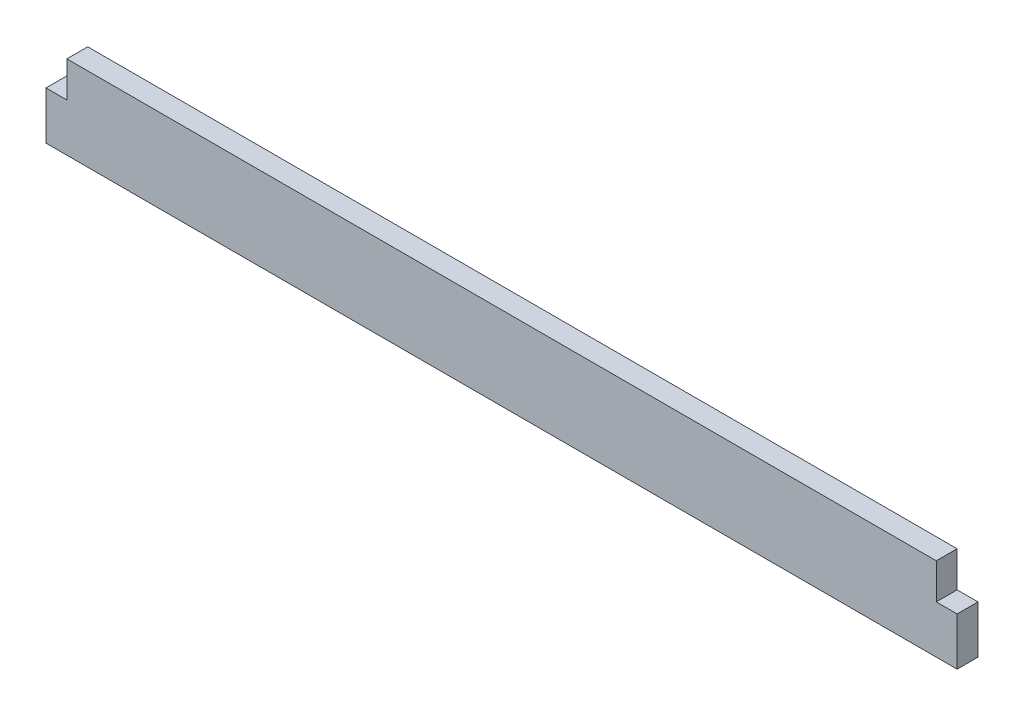
ISO-10303-21;
HEADER;
FILE_DESCRIPTION(('STEP AP214'),'2;1');
FILE_NAME('part.step','',(''),(''),'','','');
FILE_SCHEMA(('AUTOMOTIVE_DESIGN { 1 0 10303 214 1 1 1 1 }'));
ENDSEC;
DATA;
#1=APPLICATION_CONTEXT('core data for automotive mechanical design processes');
#2=APPLICATION_PROTOCOL_DEFINITION('international standard','automotive_design',2000,#1);
#3=PRODUCT_CONTEXT('',#1,'mechanical');
#4=PRODUCT('Part','Part','',(#3));
#5=PRODUCT_RELATED_PRODUCT_CATEGORY('part','',(#4));
#6=PRODUCT_DEFINITION_FORMATION('','',#4);
#7=PRODUCT_DEFINITION_CONTEXT('part definition',#1,'design');
#8=PRODUCT_DEFINITION('design','',#6,#7);
#9=PRODUCT_DEFINITION_SHAPE('','',#8);
#10=(LENGTH_UNIT() NAMED_UNIT(*) SI_UNIT(.MILLI.,.METRE.));
#11=(NAMED_UNIT(*) PLANE_ANGLE_UNIT() SI_UNIT($,.RADIAN.));
#12=(NAMED_UNIT(*) SI_UNIT($,.STERADIAN.) SOLID_ANGLE_UNIT());
#13=UNCERTAINTY_MEASURE_WITH_UNIT(LENGTH_MEASURE(1.E-05),#10,'distance_accuracy_value','');
#14=(GEOMETRIC_REPRESENTATION_CONTEXT(3) GLOBAL_UNCERTAINTY_ASSIGNED_CONTEXT((#13)) GLOBAL_UNIT_ASSIGNED_CONTEXT((#10,
#11,#12)) REPRESENTATION_CONTEXT('',''));
#15=CARTESIAN_POINT('',(0.,0.,0.));
#16=DIRECTION('',(0.,0.,1.));
#17=DIRECTION('',(1.,0.,0.));
#18=AXIS2_PLACEMENT_3D('',#15,#16,#17);
#19=CARTESIAN_POINT('',(0.,12.,3.));
#20=DIRECTION('',(1.,0.,0.));
#21=DIRECTION('',(0.,0.,-1.));
#22=AXIS2_PLACEMENT_3D('',#19,#20,#21);
#23=PLANE('',#22);
#24=DIRECTION('',(0.,-1.,0.));
#25=VECTOR('',#24,1.);
#26=CARTESIAN_POINT('',(0.,12.,0.));
#27=LINE('',#26,#25);
#28=CARTESIAN_POINT('',(0.,12.,0.));
#29=VERTEX_POINT('',#28);
#30=CARTESIAN_POINT('',(0.,6.88272984683749,0.));
#31=VERTEX_POINT('',#30);
#32=EDGE_CURVE('E136',#29,#31,#27,.T.);
#33=ORIENTED_EDGE('',*,*,#32,.T.);
#34=DIRECTION('',(0.,0.,-1.));
#35=VECTOR('',#34,1.);
#36=CARTESIAN_POINT('',(0.,6.88272984683749,3.));
#37=LINE('',#36,#35);
#38=CARTESIAN_POINT('',(0.,6.88272984683749,3.));
#39=VERTEX_POINT('',#38);
#40=EDGE_CURVE('E11',#39,#31,#37,.T.);
#41=ORIENTED_EDGE('',*,*,#40,.F.);
#42=DIRECTION('',(0.,-1.,0.));
#43=VECTOR('',#42,1.);
#44=CARTESIAN_POINT('',(0.,12.,3.));
#45=LINE('',#44,#43);
#46=CARTESIAN_POINT('',(0.,12.,3.));
#47=VERTEX_POINT('',#46);
#48=EDGE_CURVE('E151',#47,#39,#45,.T.);
#49=ORIENTED_EDGE('',*,*,#48,.F.);
#50=DIRECTION('',(0.,0.,-1.));
#51=VECTOR('',#50,1.);
#52=CARTESIAN_POINT('',(0.,12.,3.));
#53=LINE('',#52,#51);
#54=EDGE_CURVE('E132',#47,#29,#53,.T.);
#55=ORIENTED_EDGE('',*,*,#54,.T.);
#56=EDGE_LOOP('',(#33,#41,#49,#55));
#57=FACE_BOUND('',#56,.T.);
#58=ADVANCED_FACE('F39',(#57),#23,.F.);
#59=CARTESIAN_POINT('',(0.,6.88272984683749,3.));
#60=DIRECTION('',(0.,-1.,0.));
#61=DIRECTION('',(1.,0.,0.));
#62=AXIS2_PLACEMENT_3D('',#59,#60,#61);
#63=PLANE('',#62);
#64=DIRECTION('',(-1.,0.,0.));
#65=VECTOR('',#64,1.);
#66=CARTESIAN_POINT('',(0.,6.88272984683749,0.));
#67=LINE('',#66,#65);
#68=CARTESIAN_POINT('',(-3.,6.88272984683748,0.));
#69=VERTEX_POINT('',#68);
#70=EDGE_CURVE('E139',#31,#69,#67,.T.);
#71=ORIENTED_EDGE('',*,*,#70,.T.);
#72=DIRECTION('',(0.,0.,-1.));
#73=VECTOR('',#72,1.);
#74=CARTESIAN_POINT('',(-3.,6.88272984683748,3.));
#75=LINE('',#74,#73);
#76=CARTESIAN_POINT('',(-3.,6.88272984683748,3.));
#77=VERTEX_POINT('',#76);
#78=EDGE_CURVE('E47',#77,#69,#75,.T.);
#79=ORIENTED_EDGE('',*,*,#78,.F.);
#80=DIRECTION('',(-1.,0.,0.));
#81=VECTOR('',#80,1.);
#82=CARTESIAN_POINT('',(0.,6.88272984683749,3.));
#83=LINE('',#82,#81);
#84=EDGE_CURVE('E96',#39,#77,#83,.T.);
#85=ORIENTED_EDGE('',*,*,#84,.F.);
#86=ORIENTED_EDGE('',*,*,#40,.T.);
#87=EDGE_LOOP('',(#71,#79,#85,#86));
#88=FACE_BOUND('',#87,.T.);
#89=ADVANCED_FACE('F184',(#88),#63,.F.);
#90=CARTESIAN_POINT('',(-3.,6.88272984683748,3.));
#91=DIRECTION('',(1.,0.,0.));
#92=DIRECTION('',(0.,0.,-1.));
#93=AXIS2_PLACEMENT_3D('',#90,#91,#92);
#94=PLANE('',#93);
#95=DIRECTION('',(0.,-1.,0.));
#96=VECTOR('',#95,1.);
#97=CARTESIAN_POINT('',(-3.,6.88272984683748,0.));
#98=LINE('',#97,#96);
#99=CARTESIAN_POINT('',(-3.,0.,0.));
#100=VERTEX_POINT('',#99);
#101=EDGE_CURVE('E141',#69,#100,#98,.T.);
#102=ORIENTED_EDGE('',*,*,#101,.T.);
#103=DIRECTION('',(0.,0.,-1.));
#104=VECTOR('',#103,1.);
#105=CARTESIAN_POINT('',(-3.,0.,3.));
#106=LINE('',#105,#104);
#107=CARTESIAN_POINT('',(-3.,0.,3.));
#108=VERTEX_POINT('',#107);
#109=EDGE_CURVE('E158',#108,#100,#106,.T.);
#110=ORIENTED_EDGE('',*,*,#109,.F.);
#111=DIRECTION('',(0.,-1.,0.));
#112=VECTOR('',#111,1.);
#113=CARTESIAN_POINT('',(-3.,6.88272984683748,3.));
#114=LINE('',#113,#112);
#115=EDGE_CURVE('E166',#77,#108,#114,.T.);
#116=ORIENTED_EDGE('',*,*,#115,.F.);
#117=ORIENTED_EDGE('',*,*,#78,.T.);
#118=EDGE_LOOP('',(#102,#110,#116,#117));
#119=FACE_BOUND('',#118,.T.);
#120=ADVANCED_FACE('F164',(#119),#94,.F.);
#121=CARTESIAN_POINT('',(-3.,0.,3.));
#122=DIRECTION('',(0.,1.,0.));
#123=DIRECTION('',(0.,0.,1.));
#124=AXIS2_PLACEMENT_3D('',#121,#122,#123);
#125=PLANE('',#124);
#126=DIRECTION('',(1.,0.,0.));
#127=VECTOR('',#126,1.);
#128=CARTESIAN_POINT('',(-3.,0.,0.));
#129=LINE('',#128,#127);
#130=CARTESIAN_POINT('',(128.,0.,0.));
#131=VERTEX_POINT('',#130);
#132=EDGE_CURVE('E143',#100,#131,#129,.T.);
#133=ORIENTED_EDGE('',*,*,#132,.T.);
#134=DIRECTION('',(0.,0.,-1.));
#135=VECTOR('',#134,1.);
#136=CARTESIAN_POINT('',(128.,0.,3.));
#137=LINE('',#136,#135);
#138=CARTESIAN_POINT('',(128.,0.,3.));
#139=VERTEX_POINT('',#138);
#140=EDGE_CURVE('E155',#139,#131,#137,.T.);
#141=ORIENTED_EDGE('',*,*,#140,.F.);
#142=DIRECTION('',(1.,0.,0.));
#143=VECTOR('',#142,1.);
#144=CARTESIAN_POINT('',(-3.,0.,3.));
#145=LINE('',#144,#143);
#146=EDGE_CURVE('E176',#108,#139,#145,.T.);
#147=ORIENTED_EDGE('',*,*,#146,.F.);
#148=ORIENTED_EDGE('',*,*,#109,.T.);
#149=EDGE_LOOP('',(#133,#141,#147,#148));
#150=FACE_BOUND('',#149,.T.);
#151=ADVANCED_FACE('F172',(#150),#125,.F.);
#152=CARTESIAN_POINT('',(128.,0.,3.));
#153=DIRECTION('',(-1.,0.,0.));
#154=DIRECTION('',(0.,0.,1.));
#155=AXIS2_PLACEMENT_3D('',#152,#153,#154);
#156=PLANE('',#155);
#157=DIRECTION('',(0.,1.,0.));
#158=VECTOR('',#157,1.);
#159=CARTESIAN_POINT('',(128.,0.,0.));
#160=LINE('',#159,#158);
#161=CARTESIAN_POINT('',(128.,6.88272984683748,0.));
#162=VERTEX_POINT('',#161);
#163=EDGE_CURVE('E145',#131,#162,#160,.T.);
#164=ORIENTED_EDGE('',*,*,#163,.T.);
#165=DIRECTION('',(0.,0.,-1.));
#166=VECTOR('',#165,1.);
#167=CARTESIAN_POINT('',(128.,6.88272984683748,3.));
#168=LINE('',#167,#166);
#169=CARTESIAN_POINT('',(128.,6.88272984683748,3.));
#170=VERTEX_POINT('',#169);
#171=EDGE_CURVE('E127',#170,#162,#168,.T.);
#172=ORIENTED_EDGE('',*,*,#171,.F.);
#173=DIRECTION('',(0.,1.,0.));
#174=VECTOR('',#173,1.);
#175=CARTESIAN_POINT('',(128.,0.,3.));
#176=LINE('',#175,#174);
#177=EDGE_CURVE('E116',#139,#170,#176,.T.);
#178=ORIENTED_EDGE('',*,*,#177,.F.);
#179=ORIENTED_EDGE('',*,*,#140,.T.);
#180=EDGE_LOOP('',(#164,#172,#178,#179));
#181=FACE_BOUND('',#180,.T.);
#182=ADVANCED_FACE('F175',(#181),#156,.F.);
#183=CARTESIAN_POINT('',(128.,6.88272984683748,3.));
#184=DIRECTION('',(0.,-1.,0.));
#185=DIRECTION('',(0.,0.,-1.));
#186=AXIS2_PLACEMENT_3D('',#183,#184,#185);
#187=PLANE('',#186);
#188=DIRECTION('',(-1.,0.,0.));
#189=VECTOR('',#188,1.);
#190=CARTESIAN_POINT('',(128.,6.88272984683748,0.));
#191=LINE('',#190,#189);
#192=CARTESIAN_POINT('',(125.,6.88272984683748,0.));
#193=VERTEX_POINT('',#192);
#194=EDGE_CURVE('E125',#162,#193,#191,.T.);
#195=ORIENTED_EDGE('',*,*,#194,.T.);
#196=DIRECTION('',(0.,0.,-1.));
#197=VECTOR('',#196,1.);
#198=CARTESIAN_POINT('',(125.,6.88272984683748,3.));
#199=LINE('',#198,#197);
#200=CARTESIAN_POINT('',(125.,6.88272984683748,3.));
#201=VERTEX_POINT('',#200);
#202=EDGE_CURVE('E122',#201,#193,#199,.T.);
#203=ORIENTED_EDGE('',*,*,#202,.F.);
#204=DIRECTION('',(-1.,0.,0.));
#205=VECTOR('',#204,1.);
#206=CARTESIAN_POINT('',(128.,6.88272984683748,3.));
#207=LINE('',#206,#205);
#208=EDGE_CURVE('E109',#170,#201,#207,.T.);
#209=ORIENTED_EDGE('',*,*,#208,.F.);
#210=ORIENTED_EDGE('',*,*,#171,.T.);
#211=EDGE_LOOP('',(#195,#203,#209,#210));
#212=FACE_BOUND('',#211,.T.);
#213=ADVANCED_FACE('F123',(#212),#187,.F.);
#214=CARTESIAN_POINT('',(125.,6.88272984683748,3.));
#215=DIRECTION('',(-1.,0.,0.));
#216=DIRECTION('',(0.,0.,1.));
#217=AXIS2_PLACEMENT_3D('',#214,#215,#216);
#218=PLANE('',#217);
#219=DIRECTION('',(0.,1.,0.));
#220=VECTOR('',#219,1.);
#221=CARTESIAN_POINT('',(125.,6.88272984683748,0.));
#222=LINE('',#221,#220);
#223=CARTESIAN_POINT('',(125.,12.,0.));
#224=VERTEX_POINT('',#223);
#225=EDGE_CURVE('E148',#193,#224,#222,.T.);
#226=ORIENTED_EDGE('',*,*,#225,.T.);
#227=DIRECTION('',(0.,0.,-1.));
#228=VECTOR('',#227,1.);
#229=CARTESIAN_POINT('',(125.,12.,3.));
#230=LINE('',#229,#228);
#231=CARTESIAN_POINT('',(125.,12.,3.));
#232=VERTEX_POINT('',#231);
#233=EDGE_CURVE('E128',#232,#224,#230,.T.);
#234=ORIENTED_EDGE('',*,*,#233,.F.);
#235=DIRECTION('',(0.,1.,0.));
#236=VECTOR('',#235,1.);
#237=CARTESIAN_POINT('',(125.,6.88272984683748,3.));
#238=LINE('',#237,#236);
#239=EDGE_CURVE('E113',#201,#232,#238,.T.);
#240=ORIENTED_EDGE('',*,*,#239,.F.);
#241=ORIENTED_EDGE('',*,*,#202,.T.);
#242=EDGE_LOOP('',(#226,#234,#240,#241));
#243=FACE_BOUND('',#242,.T.);
#244=ADVANCED_FACE('F130',(#243),#218,.F.);
#245=CARTESIAN_POINT('',(12.,12.,3.));
#246=DIRECTION('',(0.,-1.,0.));
#247=DIRECTION('',(0.,0.,-1.));
#248=AXIS2_PLACEMENT_3D('',#245,#246,#247);
#249=PLANE('',#248);
#250=DIRECTION('',(-1.,0.,0.));
#251=VECTOR('',#250,1.);
#252=CARTESIAN_POINT('',(12.,12.,0.));
#253=LINE('',#252,#251);
#254=EDGE_CURVE('E84',#224,#29,#253,.T.);
#255=ORIENTED_EDGE('',*,*,#254,.T.);
#256=ORIENTED_EDGE('',*,*,#54,.F.);
#257=DIRECTION('',(-1.,0.,0.));
#258=VECTOR('',#257,1.);
#259=CARTESIAN_POINT('',(113.,12.,3.));
#260=LINE('',#259,#258);
#261=EDGE_CURVE('E55',#232,#47,#260,.T.);
#262=ORIENTED_EDGE('',*,*,#261,.F.);
#263=ORIENTED_EDGE('',*,*,#233,.T.);
#264=EDGE_LOOP('',(#255,#256,#262,#263));
#265=FACE_BOUND('',#264,.T.);
#266=ADVANCED_FACE('F200',(#265),#249,.F.);
#267=CARTESIAN_POINT('',(0.,0.,3.));
#268=DIRECTION('',(0.,0.,-1.));
#269=DIRECTION('',(-1.,0.,0.));
#270=AXIS2_PLACEMENT_3D('',#267,#268,#269);
#271=PLANE('',#270);
#272=ORIENTED_EDGE('',*,*,#48,.T.);
#273=ORIENTED_EDGE('',*,*,#84,.T.);
#274=ORIENTED_EDGE('',*,*,#115,.T.);
#275=ORIENTED_EDGE('',*,*,#146,.T.);
#276=ORIENTED_EDGE('',*,*,#177,.T.);
#277=ORIENTED_EDGE('',*,*,#208,.T.);
#278=ORIENTED_EDGE('',*,*,#239,.T.);
#279=ORIENTED_EDGE('',*,*,#261,.T.);
#280=EDGE_LOOP('',(#272,#273,#274,#275,#276,#277,#278,#279));
#281=FACE_BOUND('',#280,.T.);
#282=ADVANCED_FACE('F111',(#281),#271,.F.);
#283=CARTESIAN_POINT('',(0.,0.,0.));
#284=DIRECTION('',(0.,0.,-1.));
#285=DIRECTION('',(-1.,0.,0.));
#286=AXIS2_PLACEMENT_3D('',#283,#284,#285);
#287=PLANE('',#286);
#288=ORIENTED_EDGE('',*,*,#32,.F.);
#289=ORIENTED_EDGE('',*,*,#254,.F.);
#290=ORIENTED_EDGE('',*,*,#225,.F.);
#291=ORIENTED_EDGE('',*,*,#194,.F.);
#292=ORIENTED_EDGE('',*,*,#163,.F.);
#293=ORIENTED_EDGE('',*,*,#132,.F.);
#294=ORIENTED_EDGE('',*,*,#101,.F.);
#295=ORIENTED_EDGE('',*,*,#70,.F.);
#296=EDGE_LOOP('',(#288,#289,#290,#291,#292,#293,#294,#295));
#297=FACE_BOUND('',#296,.T.);
#298=ADVANCED_FACE('F168',(#297),#287,.T.);
#299=CLOSED_SHELL('',(#58,#89,#120,#151,#182,#213,#244,#266,#282,#298));
#300=MANIFOLD_SOLID_BREP('B2',#299);
#301=ADVANCED_BREP_SHAPE_REPRESENTATION('',(#18,#300),#14);
#302=SHAPE_DEFINITION_REPRESENTATION(#9,#301);
ENDSEC;
END-ISO-10303-21;
